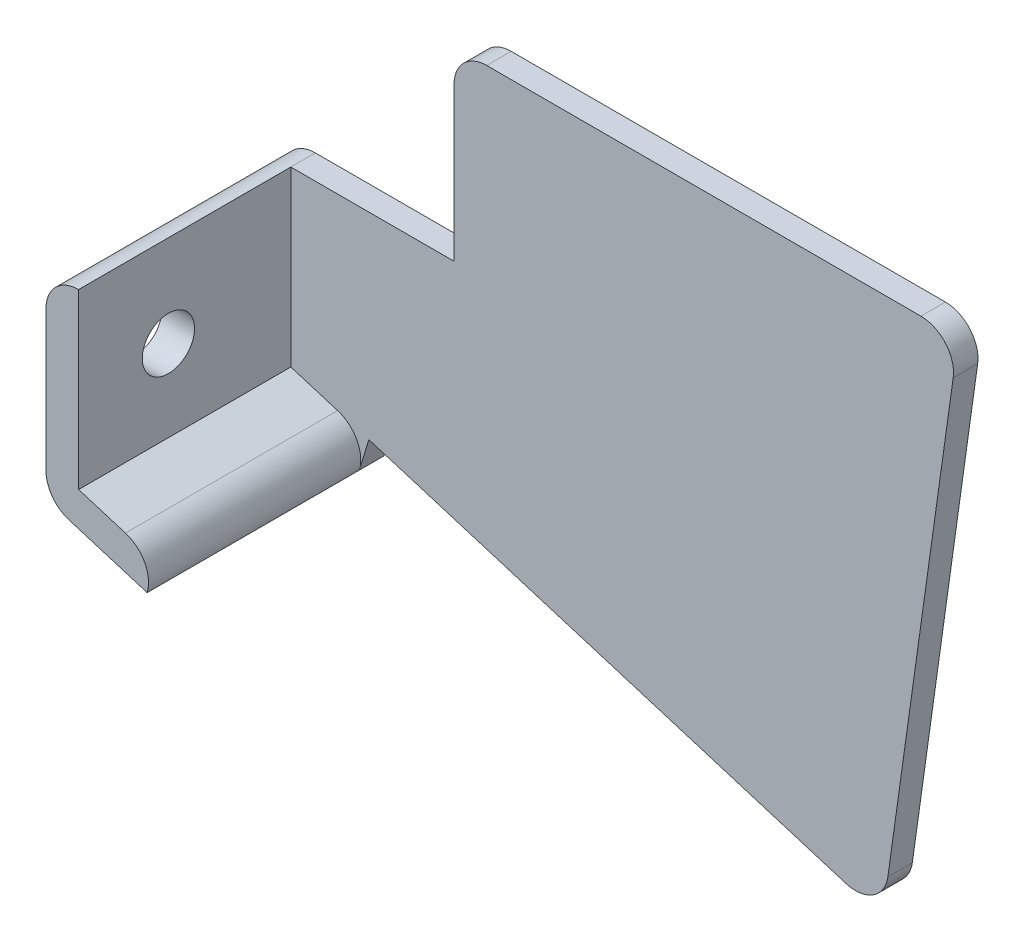
ISO-10303-21;
HEADER;
FILE_DESCRIPTION(('STEP AP214'),'2;1');
FILE_NAME('part.step','',(''),(''),'','','');
FILE_SCHEMA(('AUTOMOTIVE_DESIGN { 1 0 10303 214 1 1 1 1 }'));
ENDSEC;
DATA;
#1=APPLICATION_CONTEXT('core data for automotive mechanical design processes');
#2=APPLICATION_PROTOCOL_DEFINITION('international standard','automotive_design',2000,#1);
#3=PRODUCT_CONTEXT('',#1,'mechanical');
#4=PRODUCT('Part','Part','',(#3));
#5=PRODUCT_RELATED_PRODUCT_CATEGORY('part','',(#4));
#6=PRODUCT_DEFINITION_FORMATION('','',#4);
#7=PRODUCT_DEFINITION_CONTEXT('part definition',#1,'design');
#8=PRODUCT_DEFINITION('design','',#6,#7);
#9=PRODUCT_DEFINITION_SHAPE('','',#8);
#10=(LENGTH_UNIT() NAMED_UNIT(*) SI_UNIT(.MILLI.,.METRE.));
#11=(NAMED_UNIT(*) PLANE_ANGLE_UNIT() SI_UNIT($,.RADIAN.));
#12=(NAMED_UNIT(*) SI_UNIT($,.STERADIAN.) SOLID_ANGLE_UNIT());
#13=UNCERTAINTY_MEASURE_WITH_UNIT(LENGTH_MEASURE(1.E-05),#10,'distance_accuracy_value','');
#14=(GEOMETRIC_REPRESENTATION_CONTEXT(3) GLOBAL_UNCERTAINTY_ASSIGNED_CONTEXT((#13)) GLOBAL_UNIT_ASSIGNED_CONTEXT((#10,
#11,#12)) REPRESENTATION_CONTEXT('',''));
#15=CARTESIAN_POINT('',(0.,0.,0.));
#16=DIRECTION('',(0.,0.,1.));
#17=DIRECTION('',(1.,0.,0.));
#18=AXIS2_PLACEMENT_3D('',#15,#16,#17);
#19=CARTESIAN_POINT('',(20.0779656872939,-36.4951576865951,1.5));
#20=DIRECTION('',(-0.990268068741571,0.139173100960062,0.));
#21=DIRECTION('',(-0.139173100960062,-0.990268068741571,0.));
#22=AXIS2_PLACEMENT_3D('',#19,#20,#21);
#23=PLANE('',#22);
#24=DIRECTION('',(0.139173100960062,0.990268068741571,0.));
#25=VECTOR('',#24,1.);
#26=CARTESIAN_POINT('',(20.0779656872939,-36.4951576865951,1.5));
#27=LINE('',#26,#25);
#28=CARTESIAN_POINT('',(20.4038672170412,-34.1762478093528,1.5));
#29=VERTEX_POINT('',#28);
#30=CARTESIAN_POINT('',(24.4073443131452,-5.69002809547447,1.5));
#31=VERTEX_POINT('',#30);
#32=EDGE_CURVE('E267',#29,#31,#27,.T.);
#33=ORIENTED_EDGE('',*,*,#32,.F.);
#34=DIRECTION('',(0.,0.,-1.));
#35=VECTOR('',#34,1.);
#36=CARTESIAN_POINT('',(20.4038672170412,-34.1762478093528,1.5));
#37=LINE('',#36,#35);
#38=CARTESIAN_POINT('',(20.4038672170412,-34.1762478093528,0.));
#39=VERTEX_POINT('',#38);
#40=EDGE_CURVE('E229',#29,#39,#37,.T.);
#41=ORIENTED_EDGE('',*,*,#40,.T.);
#42=DIRECTION('',(0.139173100960062,0.990268068741571,0.));
#43=VECTOR('',#42,1.);
#44=CARTESIAN_POINT('',(20.0779656872939,-36.4951576865951,0.));
#45=LINE('',#44,#43);
#46=CARTESIAN_POINT('',(24.4073443131452,-5.69002809547447,0.));
#47=VERTEX_POINT('',#46);
#48=EDGE_CURVE('E289',#39,#47,#45,.T.);
#49=ORIENTED_EDGE('',*,*,#48,.T.);
#50=DIRECTION('',(0.,0.,-1.));
#51=VECTOR('',#50,1.);
#52=CARTESIAN_POINT('',(24.4073443131452,-5.69002809547447,1.5));
#53=LINE('',#52,#51);
#54=EDGE_CURVE('E226',#47,#31,#53,.F.);
#55=ORIENTED_EDGE('',*,*,#54,.T.);
#56=EDGE_LOOP('',(#33,#41,#49,#55));
#57=FACE_BOUND('',#56,.T.);
#58=ADVANCED_FACE('F45',(#57),#23,.F.);
#59=CARTESIAN_POINT('',(-6.17422455122754,-3.41168189355435,1.5));
#60=DIRECTION('',(0.,-1.,0.));
#61=DIRECTION('',(0.,0.,-1.));
#62=AXIS2_PLACEMENT_3D('',#59,#60,#61);
#63=PLANE('',#62);
#64=DIRECTION('',(-1.,0.,0.));
#65=VECTOR('',#64,1.);
#66=CARTESIAN_POINT('',(-6.17422455122754,-3.41168189355435,0.));
#67=LINE('',#66,#65);
#68=CARTESIAN_POINT('',(22.4268081756621,-3.41168189355435,0.));
#69=VERTEX_POINT('',#68);
#70=CARTESIAN_POINT('',(-4.17422455122754,-3.41168189355435,0.));
#71=VERTEX_POINT('',#70);
#72=EDGE_CURVE('E260',#69,#71,#67,.T.);
#73=ORIENTED_EDGE('',*,*,#72,.T.);
#74=DIRECTION('',(0.,0.,-1.));
#75=VECTOR('',#74,1.);
#76=CARTESIAN_POINT('',(-4.17422455122754,-3.41168189355435,1.5));
#77=LINE('',#76,#75);
#78=CARTESIAN_POINT('',(-4.17422455122754,-3.41168189355435,1.5));
#79=VERTEX_POINT('',#78);
#80=EDGE_CURVE('E54',#71,#79,#77,.F.);
#81=ORIENTED_EDGE('',*,*,#80,.T.);
#82=DIRECTION('',(-1.,0.,0.));
#83=VECTOR('',#82,1.);
#84=CARTESIAN_POINT('',(-6.17422455122754,-3.41168189355435,1.5));
#85=LINE('',#84,#83);
#86=CARTESIAN_POINT('',(22.4268081756621,-3.41168189355435,1.5));
#87=VERTEX_POINT('',#86);
#88=EDGE_CURVE('E257',#87,#79,#85,.T.);
#89=ORIENTED_EDGE('',*,*,#88,.F.);
#90=DIRECTION('',(0.,0.,-1.));
#91=VECTOR('',#90,1.);
#92=CARTESIAN_POINT('',(22.4268081756621,-3.41168189355435,1.5));
#93=LINE('',#92,#91);
#94=EDGE_CURVE('E248',#87,#69,#93,.T.);
#95=ORIENTED_EDGE('',*,*,#94,.T.);
#96=EDGE_LOOP('',(#73,#81,#89,#95));
#97=FACE_BOUND('',#96,.T.);
#98=ADVANCED_FACE('F256',(#97),#63,.F.);
#99=CARTESIAN_POINT('',(-6.17422455122754,-3.41168189355435,1.5));
#100=DIRECTION('',(1.,0.,0.));
#101=DIRECTION('',(0.,1.,0.));
#102=AXIS2_PLACEMENT_3D('',#99,#100,#101);
#103=PLANE('',#102);
#104=DIRECTION('',(0.,-1.,0.));
#105=VECTOR('',#104,1.);
#106=CARTESIAN_POINT('',(-6.17422455122754,-3.41168189355435,1.5));
#107=LINE('',#106,#105);
#108=CARTESIAN_POINT('',(-6.17422455122754,-5.41168189355435,1.5));
#109=VERTEX_POINT('',#108);
#110=CARTESIAN_POINT('',(-6.17422455122754,-14.8002894976858,1.5));
#111=VERTEX_POINT('',#110);
#112=EDGE_CURVE('E266',#109,#111,#107,.T.);
#113=ORIENTED_EDGE('',*,*,#112,.F.);
#114=DIRECTION('',(0.,0.,-1.));
#115=VECTOR('',#114,1.);
#116=CARTESIAN_POINT('',(-6.17422455122754,-5.41168189355435,1.5));
#117=LINE('',#116,#115);
#118=CARTESIAN_POINT('',(-6.17422455122754,-5.41168189355435,0.));
#119=VERTEX_POINT('',#118);
#120=EDGE_CURVE('E244',#109,#119,#117,.T.);
#121=ORIENTED_EDGE('',*,*,#120,.T.);
#122=DIRECTION('',(0.,-1.,0.));
#123=VECTOR('',#122,1.);
#124=CARTESIAN_POINT('',(-6.17422455122754,-3.41168189355435,0.));
#125=LINE('',#124,#123);
#126=CARTESIAN_POINT('',(-6.17422455122754,-14.8002894976858,0.));
#127=VERTEX_POINT('',#126);
#128=EDGE_CURVE('E275',#119,#127,#125,.T.);
#129=ORIENTED_EDGE('',*,*,#128,.T.);
#130=DIRECTION('',(0.,0.,-1.));
#131=VECTOR('',#130,1.);
#132=CARTESIAN_POINT('',(-6.17422455122754,-14.8002894976858,1.5));
#133=LINE('',#132,#131);
#134=EDGE_CURVE('E300',#111,#127,#133,.T.);
#135=ORIENTED_EDGE('',*,*,#134,.F.);
#136=EDGE_LOOP('',(#113,#121,#129,#135));
#137=FACE_BOUND('',#136,.T.);
#138=ADVANCED_FACE('F273',(#137),#103,.F.);
#139=CARTESIAN_POINT('',(-18.1742245512275,-14.8002894976858,1.5));
#140=DIRECTION('',(0.,-1.,0.));
#141=DIRECTION('',(0.,0.,-1.));
#142=AXIS2_PLACEMENT_3D('',#139,#140,#141);
#143=PLANE('',#142);
#144=DIRECTION('',(-1.,0.,0.));
#145=VECTOR('',#144,1.);
#146=CARTESIAN_POINT('',(-18.1742245512275,-14.8002894976858,0.));
#147=LINE('',#146,#145);
#148=CARTESIAN_POINT('',(-16.1742245512275,-14.8002894976858,0.));
#149=VERTEX_POINT('',#148);
#150=EDGE_CURVE('E282',#127,#149,#147,.T.);
#151=ORIENTED_EDGE('',*,*,#150,.T.);
#152=DIRECTION('',(0.,0.,-1.));
#153=VECTOR('',#152,1.);
#154=CARTESIAN_POINT('',(-16.1742245512275,-14.8002894976858,1.5));
#155=LINE('',#154,#153);
#156=CARTESIAN_POINT('',(-16.1742245512275,-14.8002894976858,1.5));
#157=VERTEX_POINT('',#156);
#158=EDGE_CURVE('E219',#149,#157,#155,.F.);
#159=ORIENTED_EDGE('',*,*,#158,.T.);
#160=DIRECTION('',(-1.,0.,0.));
#161=VECTOR('',#160,1.);
#162=CARTESIAN_POINT('',(-18.1742245512275,-14.8002894976858,1.5));
#163=LINE('',#162,#161);
#164=EDGE_CURVE('E349',#111,#157,#163,.T.);
#165=ORIENTED_EDGE('',*,*,#164,.F.);
#166=ORIENTED_EDGE('',*,*,#134,.T.);
#167=EDGE_LOOP('',(#151,#159,#165,#166));
#168=FACE_BOUND('',#167,.T.);
#169=ADVANCED_FACE('F436',(#168),#143,.F.);
#170=CARTESIAN_POINT('',(-18.1742245512275,-14.8002894976858,1.5));
#171=DIRECTION('',(1.,0.,0.));
#172=DIRECTION('',(0.,1.,0.));
#173=AXIS2_PLACEMENT_3D('',#170,#171,#172);
#174=PLANE('',#173);
#175=CARTESIAN_POINT('',(-18.1742245512275,-20.4117508606031,9.));
#176=DIRECTION('',(1.,0.,0.));
#177=DIRECTION('',(0.,1.,0.));
#178=AXIS2_PLACEMENT_3D('',#175,#176,#177);
#179=CIRCLE('',#178,1.6);
#180=CARTESIAN_POINT('',(-18.1742245512275,-18.8117508606031,9.));
#181=VERTEX_POINT('',#180);
#182=EDGE_CURVE('E397',#181,#181,#179,.F.);
#183=ORIENTED_EDGE('',*,*,#182,.F.);
#184=EDGE_LOOP('',(#183));
#185=FACE_BOUND('',#184,.T.);
#186=DIRECTION('',(0.,1.,0.));
#187=VECTOR('',#186,1.);
#188=CARTESIAN_POINT('',(-18.1742245512275,-14.8002894976858,14.5));
#189=LINE('',#188,#187);
#190=CARTESIAN_POINT('',(-18.1742245512275,-25.4117508606031,14.5));
#191=VERTEX_POINT('',#190);
#192=CARTESIAN_POINT('',(-18.1742245512275,-16.8002894976858,14.5));
#193=VERTEX_POINT('',#192);
#194=EDGE_CURVE('E183',#191,#193,#189,.T.);
#195=ORIENTED_EDGE('',*,*,#194,.T.);
#196=DIRECTION('',(0.,0.,-1.));
#197=VECTOR('',#196,1.);
#198=CARTESIAN_POINT('',(-18.1742245512275,-16.8002894976858,1.5));
#199=LINE('',#198,#197);
#200=CARTESIAN_POINT('',(-18.1742245512275,-16.8002894976858,0.));
#201=VERTEX_POINT('',#200);
#202=EDGE_CURVE('E188',#193,#201,#199,.T.);
#203=ORIENTED_EDGE('',*,*,#202,.T.);
#204=DIRECTION('',(0.,-1.,0.));
#205=VECTOR('',#204,1.);
#206=CARTESIAN_POINT('',(-18.1742245512275,-14.8002894976858,0.));
#207=LINE('',#206,#205);
#208=CARTESIAN_POINT('',(-18.1742245512275,-25.4117508606031,0.));
#209=VERTEX_POINT('',#208);
#210=EDGE_CURVE('E287',#201,#209,#207,.T.);
#211=ORIENTED_EDGE('',*,*,#210,.T.);
#212=DIRECTION('',(0.,0.,-1.));
#213=VECTOR('',#212,1.);
#214=CARTESIAN_POINT('',(-18.1742245512275,-25.4117508606031,14.5));
#215=LINE('',#214,#213);
#216=EDGE_CURVE('E195',#209,#191,#215,.F.);
#217=ORIENTED_EDGE('',*,*,#216,.T.);
#218=EDGE_LOOP('',(#195,#203,#211,#217));
#219=FACE_BOUND('',#218,.T.);
#220=ADVANCED_FACE('F433',(#185,#219),#174,.F.);
#221=CARTESIAN_POINT('',(-18.1742245512275,-24.8002894976858,1.5));
#222=DIRECTION('',(0.292371704722734,0.956304755963036,0.));
#223=DIRECTION('',(-0.956304755963036,0.292371704722734,0.));
#224=AXIS2_PLACEMENT_3D('',#221,#222,#223);
#225=PLANE('',#224);
#226=DIRECTION('',(0.956304755963036,-0.292371704722734,0.));
#227=VECTOR('',#226,1.);
#228=CARTESIAN_POINT('',(-18.1742245512275,-24.8002894976858,0.));
#229=LINE('',#228,#227);
#230=CARTESIAN_POINT('',(-11.3927007714124,-26.8736093842168,0.));
#231=VERTEX_POINT('',#230);
#232=CARTESIAN_POINT('',(17.8385876701126,-35.8105111193588,0.));
#233=VERTEX_POINT('',#232);
#234=EDGE_CURVE('E296',#231,#233,#229,.T.);
#235=ORIENTED_EDGE('',*,*,#234,.T.);
#236=DIRECTION('',(0.,0.,-1.));
#237=VECTOR('',#236,1.);
#238=CARTESIAN_POINT('',(17.8385876701125,-35.8105111193588,1.5));
#239=LINE('',#238,#237);
#240=CARTESIAN_POINT('',(17.8385876701126,-35.8105111193588,1.5));
#241=VERTEX_POINT('',#240);
#242=EDGE_CURVE('E233',#233,#241,#239,.F.);
#243=ORIENTED_EDGE('',*,*,#242,.T.);
#244=DIRECTION('',(0.956304755963036,-0.292371704722734,0.));
#245=VECTOR('',#244,1.);
#246=CARTESIAN_POINT('',(-18.1742245512275,-24.8002894976858,1.5));
#247=LINE('',#246,#245);
#248=CARTESIAN_POINT('',(-11.3927007714124,-26.8736093842168,1.5));
#249=VERTEX_POINT('',#248);
#250=EDGE_CURVE('E304',#249,#241,#247,.T.);
#251=ORIENTED_EDGE('',*,*,#250,.F.);
#252=DIRECTION('',(0.,0.,-1.));
#253=VECTOR('',#252,1.);
#254=CARTESIAN_POINT('',(-11.3927007714124,-26.8736093842168,14.5));
#255=LINE('',#254,#253);
#256=EDGE_CURVE('E315',#249,#231,#255,.T.);
#257=ORIENTED_EDGE('',*,*,#256,.T.);
#258=EDGE_LOOP('',(#235,#243,#251,#257));
#259=FACE_BOUND('',#258,.T.);
#260=ADVANCED_FACE('F394',(#259),#225,.F.);
#261=CARTESIAN_POINT('',(0.,0.,1.5));
#262=DIRECTION('',(0.,0.,-1.));
#263=DIRECTION('',(-1.,0.,0.));
#264=AXIS2_PLACEMENT_3D('',#261,#262,#263);
#265=PLANE('',#264);
#266=ORIENTED_EDGE('',*,*,#250,.T.);
#267=CARTESIAN_POINT('',(18.423331079558,-33.8979016074327,1.5));
#268=DIRECTION('',(0.,0.,-1.));
#269=DIRECTION('',(-1.,0.,0.));
#270=AXIS2_PLACEMENT_3D('',#267,#268,#269);
#271=CIRCLE('',#270,2.);
#272=EDGE_CURVE('E241',#241,#29,#271,.F.);
#273=ORIENTED_EDGE('',*,*,#272,.T.);
#274=ORIENTED_EDGE('',*,*,#32,.T.);
#275=CARTESIAN_POINT('',(22.4268081756621,-5.41168189355435,1.5));
#276=DIRECTION('',(0.,0.,-1.));
#277=DIRECTION('',(-1.,0.,0.));
#278=AXIS2_PLACEMENT_3D('',#275,#276,#277);
#279=CIRCLE('',#278,2.);
#280=EDGE_CURVE('E236',#31,#87,#279,.F.);
#281=ORIENTED_EDGE('',*,*,#280,.T.);
#282=ORIENTED_EDGE('',*,*,#88,.T.);
#283=CARTESIAN_POINT('',(-4.17422455122754,-5.41168189355435,1.5));
#284=DIRECTION('',(0.,0.,-1.));
#285=DIRECTION('',(-1.,0.,0.));
#286=AXIS2_PLACEMENT_3D('',#283,#284,#285);
#287=CIRCLE('',#286,2.);
#288=EDGE_CURVE('E67',#79,#109,#287,.F.);
#289=ORIENTED_EDGE('',*,*,#288,.T.);
#290=ORIENTED_EDGE('',*,*,#112,.T.);
#291=ORIENTED_EDGE('',*,*,#164,.T.);
#292=DIRECTION('',(0.,-1.,0.));
#293=VECTOR('',#292,1.);
#294=CARTESIAN_POINT('',(-16.1742245512275,0.,1.5));
#295=LINE('',#294,#293);
#296=CARTESIAN_POINT('',(-16.1742245512275,-25.4117508606031,1.5));
#297=VERTEX_POINT('',#296);
#298=EDGE_CURVE('E165',#157,#297,#295,.T.);
#299=ORIENTED_EDGE('',*,*,#298,.T.);
#300=DIRECTION('',(0.956304755963036,-0.292371704722735,0.));
#301=VECTOR('',#300,1.);
#302=CARTESIAN_POINT('',(-8.48762771866673,-27.7617793483199,1.5));
#303=LINE('',#302,#301);
#304=CARTESIAN_POINT('',(-13.3053102833384,-26.2888659747713,1.5));
#305=VERTEX_POINT('',#304);
#306=EDGE_CURVE('E333',#297,#305,#303,.T.);
#307=ORIENTED_EDGE('',*,*,#306,.T.);
#308=CARTESIAN_POINT('',(-13.8900536927839,-28.2014754866974,1.5));
#309=DIRECTION('',(0.,0.,-1.));
#310=DIRECTION('',(-1.,0.,0.));
#311=AXIS2_PLACEMENT_3D('',#308,#309,#310);
#312=CIRCLE('',#311,2.);
#313=CARTESIAN_POINT('',(-11.9774441808578,-28.7862188961428,1.5));
#314=VERTEX_POINT('',#313);
#315=EDGE_CURVE('E11',#305,#314,#312,.T.);
#316=ORIENTED_EDGE('',*,*,#315,.T.);
#317=DIRECTION('',(-0.292371704722734,-0.956304755963036,0.));
#318=VECTOR('',#317,1.);
#319=CARTESIAN_POINT('',(-2.90507305274566,0.88816996410311,1.5));
#320=LINE('',#319,#318);
#321=EDGE_CURVE('E60',#249,#314,#320,.T.);
#322=ORIENTED_EDGE('',*,*,#321,.F.);
#323=EDGE_LOOP('',(#266,#273,#274,#281,#282,#289,#290,#291,#299,#307,#316,#322));
#324=FACE_BOUND('',#323,.T.);
#325=ADVANCED_FACE('F262',(#324),#265,.F.);
#326=CARTESIAN_POINT('',(0.,0.,0.));
#327=DIRECTION('',(0.,0.,-1.));
#328=DIRECTION('',(-1.,0.,0.));
#329=AXIS2_PLACEMENT_3D('',#326,#327,#328);
#330=PLANE('',#329);
#331=ORIENTED_EDGE('',*,*,#210,.F.);
#332=CARTESIAN_POINT('',(-16.1742245512275,-16.8002894976858,0.));
#333=DIRECTION('',(0.,0.,-1.));
#334=DIRECTION('',(-1.,0.,0.));
#335=AXIS2_PLACEMENT_3D('',#332,#333,#334);
#336=CIRCLE('',#335,2.);
#337=EDGE_CURVE('E216',#201,#149,#336,.T.);
#338=ORIENTED_EDGE('',*,*,#337,.T.);
#339=ORIENTED_EDGE('',*,*,#150,.F.);
#340=ORIENTED_EDGE('',*,*,#128,.F.);
#341=CARTESIAN_POINT('',(-4.17422455122754,-5.41168189355435,0.));
#342=DIRECTION('',(0.,0.,-1.));
#343=DIRECTION('',(-1.,0.,0.));
#344=AXIS2_PLACEMENT_3D('',#341,#342,#343);
#345=CIRCLE('',#344,2.);
#346=EDGE_CURVE('E207',#119,#71,#345,.T.);
#347=ORIENTED_EDGE('',*,*,#346,.T.);
#348=ORIENTED_EDGE('',*,*,#72,.F.);
#349=CARTESIAN_POINT('',(22.4268081756621,-5.41168189355435,0.));
#350=DIRECTION('',(0.,0.,-1.));
#351=DIRECTION('',(-1.,0.,0.));
#352=AXIS2_PLACEMENT_3D('',#349,#350,#351);
#353=CIRCLE('',#352,2.);
#354=EDGE_CURVE('E204',#69,#47,#353,.T.);
#355=ORIENTED_EDGE('',*,*,#354,.T.);
#356=ORIENTED_EDGE('',*,*,#48,.F.);
#357=CARTESIAN_POINT('',(18.423331079558,-33.8979016074327,0.));
#358=DIRECTION('',(0.,0.,-1.));
#359=DIRECTION('',(-1.,0.,0.));
#360=AXIS2_PLACEMENT_3D('',#357,#358,#359);
#361=CIRCLE('',#360,2.);
#362=EDGE_CURVE('E210',#39,#233,#361,.T.);
#363=ORIENTED_EDGE('',*,*,#362,.T.);
#364=ORIENTED_EDGE('',*,*,#234,.F.);
#365=DIRECTION('',(-0.292371704722734,-0.956304755963036,0.));
#366=VECTOR('',#365,1.);
#367=CARTESIAN_POINT('',(-11.3927007714124,-26.8736093842168,0.));
#368=LINE('',#367,#366);
#369=CARTESIAN_POINT('',(-11.9774441808578,-28.7862188961428,0.));
#370=VERTEX_POINT('',#369);
#371=EDGE_CURVE('E395',#231,#370,#368,.T.);
#372=ORIENTED_EDGE('',*,*,#371,.T.);
#373=DIRECTION('',(-0.956304755963036,0.292371704722734,0.));
#374=VECTOR('',#373,1.);
#375=CARTESIAN_POINT('',(-11.9774441808578,-28.7862188961428,0.));
#376=LINE('',#375,#374);
#377=CARTESIAN_POINT('',(-16.758967960673,-27.3243603725292,0.));
#378=VERTEX_POINT('',#377);
#379=EDGE_CURVE('E324',#370,#378,#376,.T.);
#380=ORIENTED_EDGE('',*,*,#379,.T.);
#381=CARTESIAN_POINT('',(-16.1742245512275,-25.4117508606031,0.));
#382=DIRECTION('',(0.,0.,-1.));
#383=DIRECTION('',(-1.,0.,0.));
#384=AXIS2_PLACEMENT_3D('',#381,#382,#383);
#385=CIRCLE('',#384,2.);
#386=EDGE_CURVE('E213',#378,#209,#385,.T.);
#387=ORIENTED_EDGE('',*,*,#386,.T.);
#388=EDGE_LOOP('',(#331,#338,#339,#340,#347,#348,#355,#356,#363,#364,#372,#380,#387));
#389=FACE_BOUND('',#388,.T.);
#390=ADVANCED_FACE('F280',(#389),#330,.T.);
#391=CARTESIAN_POINT('',(-16.1742245512275,-25.4117508606031,14.5));
#392=DIRECTION('',(0.292371704722735,0.956304755963036,0.));
#393=DIRECTION('',(-0.956304755963036,0.292371704722735,0.));
#394=AXIS2_PLACEMENT_3D('',#391,#392,#393);
#395=PLANE('',#394);
#396=DIRECTION('',(0.956304755963036,-0.292371704722735,0.));
#397=VECTOR('',#396,1.);
#398=CARTESIAN_POINT('',(-16.1742245512275,-25.4117508606031,14.5));
#399=LINE('',#398,#397);
#400=CARTESIAN_POINT('',(-16.1742245512275,-25.4117508606031,14.5));
#401=VERTEX_POINT('',#400);
#402=CARTESIAN_POINT('',(-13.3053102833384,-26.2888659747713,14.5));
#403=VERTEX_POINT('',#402);
#404=EDGE_CURVE('E181',#401,#403,#399,.T.);
#405=ORIENTED_EDGE('',*,*,#404,.T.);
#406=DIRECTION('',(0.,0.,-1.));
#407=VECTOR('',#406,1.);
#408=CARTESIAN_POINT('',(-13.3053102833384,-26.2888659747713,14.5));
#409=LINE('',#408,#407);
#410=EDGE_CURVE('E303',#403,#305,#409,.T.);
#411=ORIENTED_EDGE('',*,*,#410,.T.);
#412=ORIENTED_EDGE('',*,*,#306,.F.);
#413=DIRECTION('',(0.,0.,-1.));
#414=VECTOR('',#413,1.);
#415=CARTESIAN_POINT('',(-16.1742245512275,-25.4117508606031,14.5));
#416=LINE('',#415,#414);
#417=EDGE_CURVE('E170',#401,#297,#416,.T.);
#418=ORIENTED_EDGE('',*,*,#417,.F.);
#419=EDGE_LOOP('',(#405,#411,#412,#418));
#420=FACE_BOUND('',#419,.T.);
#421=ADVANCED_FACE('F416',(#420),#395,.T.);
#422=CARTESIAN_POINT('',(-16.1742245512275,-14.8002894976858,14.5));
#423=DIRECTION('',(1.,0.,0.));
#424=DIRECTION('',(0.,0.,-1.));
#425=AXIS2_PLACEMENT_3D('',#422,#423,#424);
#426=PLANE('',#425);
#427=CARTESIAN_POINT('',(-16.1742245512275,-20.4117508606031,9.));
#428=DIRECTION('',(1.,0.,0.));
#429=DIRECTION('',(0.,0.,-1.));
#430=AXIS2_PLACEMENT_3D('',#427,#428,#429);
#431=CIRCLE('',#430,1.6);
#432=CARTESIAN_POINT('',(-16.1742245512275,-20.4117508606031,7.4));
#433=VERTEX_POINT('',#432);
#434=EDGE_CURVE('E401',#433,#433,#431,.T.);
#435=ORIENTED_EDGE('',*,*,#434,.F.);
#436=EDGE_LOOP('',(#435));
#437=FACE_BOUND('',#436,.T.);
#438=ORIENTED_EDGE('',*,*,#298,.F.);
#439=DIRECTION('',(0.,0.,-1.));
#440=VECTOR('',#439,1.);
#441=CARTESIAN_POINT('',(-16.1742245512275,-14.8002894976858,14.5));
#442=LINE('',#441,#440);
#443=CARTESIAN_POINT('',(-16.1742245512275,-14.8002894976858,14.5));
#444=VERTEX_POINT('',#443);
#445=EDGE_CURVE('E160',#444,#157,#442,.T.);
#446=ORIENTED_EDGE('',*,*,#445,.F.);
#447=DIRECTION('',(0.,-1.,0.));
#448=VECTOR('',#447,1.);
#449=CARTESIAN_POINT('',(-16.1742245512275,-14.8002894976858,14.5));
#450=LINE('',#449,#448);
#451=EDGE_CURVE('E164',#444,#401,#450,.T.);
#452=ORIENTED_EDGE('',*,*,#451,.T.);
#453=ORIENTED_EDGE('',*,*,#417,.T.);
#454=EDGE_LOOP('',(#438,#446,#452,#453));
#455=FACE_BOUND('',#454,.T.);
#456=ADVANCED_FACE('F162',(#437,#455),#426,.T.);
#457=CARTESIAN_POINT('',(-11.9774441808578,-28.7862188961428,14.5));
#458=DIRECTION('',(-0.292371704722734,-0.956304755963036,0.));
#459=DIRECTION('',(0.956304755963036,-0.292371704722734,0.));
#460=AXIS2_PLACEMENT_3D('',#457,#458,#459);
#461=PLANE('',#460);
#462=DIRECTION('',(-0.956304755963036,0.292371704722734,0.));
#463=VECTOR('',#462,1.);
#464=CARTESIAN_POINT('',(-11.9774441808578,-28.7862188961428,14.5));
#465=LINE('',#464,#463);
#466=CARTESIAN_POINT('',(-11.9774441808578,-28.7862188961428,14.5));
#467=VERTEX_POINT('',#466);
#468=CARTESIAN_POINT('',(-16.758967960673,-27.3243603725292,14.5));
#469=VERTEX_POINT('',#468);
#470=EDGE_CURVE('E171',#467,#469,#465,.T.);
#471=ORIENTED_EDGE('',*,*,#470,.T.);
#472=DIRECTION('',(0.,0.,-1.));
#473=VECTOR('',#472,1.);
#474=CARTESIAN_POINT('',(-16.758967960673,-27.3243603725292,0.));
#475=LINE('',#474,#473);
#476=EDGE_CURVE('E222',#469,#378,#475,.T.);
#477=ORIENTED_EDGE('',*,*,#476,.T.);
#478=ORIENTED_EDGE('',*,*,#379,.F.);
#479=DIRECTION('',(0.,0.,-1.));
#480=VECTOR('',#479,1.);
#481=CARTESIAN_POINT('',(-11.9774441808578,-28.7862188961428,14.5));
#482=LINE('',#481,#480);
#483=EDGE_CURVE('E312',#314,#370,#482,.T.);
#484=ORIENTED_EDGE('',*,*,#483,.F.);
#485=EDGE_CURVE('E322',#467,#314,#482,.T.);
#486=ORIENTED_EDGE('',*,*,#485,.F.);
#487=EDGE_LOOP('',(#471,#477,#478,#484,#486));
#488=FACE_BOUND('',#487,.T.);
#489=ADVANCED_FACE('F321',(#488),#461,.T.);
#490=CARTESIAN_POINT('',(-11.3927007714124,-26.8736093842168,14.5));
#491=DIRECTION('',(0.956304755963036,-0.292371704722734,0.));
#492=DIRECTION('',(0.292371704722734,0.956304755963036,0.));
#493=AXIS2_PLACEMENT_3D('',#490,#491,#492);
#494=PLANE('',#493);
#495=ORIENTED_EDGE('',*,*,#256,.F.);
#496=ORIENTED_EDGE('',*,*,#321,.T.);
#497=ORIENTED_EDGE('',*,*,#483,.T.);
#498=ORIENTED_EDGE('',*,*,#371,.F.);
#499=EDGE_LOOP('',(#495,#496,#497,#498));
#500=FACE_BOUND('',#499,.T.);
#501=ADVANCED_FACE('F310',(#500),#494,.T.);
#502=CARTESIAN_POINT('',(0.,0.,14.5));
#503=DIRECTION('',(0.,0.,1.));
#504=DIRECTION('',(1.,0.,0.));
#505=AXIS2_PLACEMENT_3D('',#502,#503,#504);
#506=PLANE('',#505);
#507=ORIENTED_EDGE('',*,*,#470,.F.);
#508=CARTESIAN_POINT('',(-13.8900536927839,-28.2014754866974,14.5));
#509=DIRECTION('',(0.,0.,1.));
#510=DIRECTION('',(1.,0.,0.));
#511=AXIS2_PLACEMENT_3D('',#508,#509,#510);
#512=CIRCLE('',#511,2.);
#513=EDGE_CURVE('E190',#467,#403,#512,.T.);
#514=ORIENTED_EDGE('',*,*,#513,.T.);
#515=ORIENTED_EDGE('',*,*,#404,.F.);
#516=ORIENTED_EDGE('',*,*,#451,.F.);
#517=CARTESIAN_POINT('',(-16.1742245512275,-16.8002894976858,14.5));
#518=DIRECTION('',(0.,0.,1.));
#519=DIRECTION('',(1.,0.,0.));
#520=AXIS2_PLACEMENT_3D('',#517,#518,#519);
#521=CIRCLE('',#520,2.);
#522=EDGE_CURVE('E178',#444,#193,#521,.T.);
#523=ORIENTED_EDGE('',*,*,#522,.T.);
#524=ORIENTED_EDGE('',*,*,#194,.F.);
#525=CARTESIAN_POINT('',(-16.1742245512275,-25.4117508606031,14.5));
#526=DIRECTION('',(0.,0.,1.));
#527=DIRECTION('',(1.,0.,0.));
#528=AXIS2_PLACEMENT_3D('',#525,#526,#527);
#529=CIRCLE('',#528,2.);
#530=EDGE_CURVE('E191',#191,#469,#529,.T.);
#531=ORIENTED_EDGE('',*,*,#530,.T.);
#532=EDGE_LOOP('',(#507,#514,#515,#516,#523,#524,#531));
#533=FACE_BOUND('',#532,.T.);
#534=ADVANCED_FACE('F176',(#533),#506,.T.);
#535=CARTESIAN_POINT('',(-13.8900536927839,-28.2014754866974,14.5));
#536=DIRECTION('',(0.,0.,-1.));
#537=DIRECTION('',(-1.,0.,0.));
#538=AXIS2_PLACEMENT_3D('',#535,#536,#537);
#539=CYLINDRICAL_SURFACE('',#538,2.);
#540=ORIENTED_EDGE('',*,*,#513,.F.);
#541=ORIENTED_EDGE('',*,*,#485,.T.);
#542=ORIENTED_EDGE('',*,*,#315,.F.);
#543=ORIENTED_EDGE('',*,*,#410,.F.);
#544=EDGE_LOOP('',(#540,#541,#542,#543));
#545=FACE_BOUND('',#544,.T.);
#546=ADVANCED_FACE('F329',(#545),#539,.T.);
#547=CARTESIAN_POINT('',(-16.1742245512275,-16.8002894976858,1.5));
#548=DIRECTION('',(0.,0.,-1.));
#549=DIRECTION('',(-1.,0.,0.));
#550=AXIS2_PLACEMENT_3D('',#547,#548,#549);
#551=CYLINDRICAL_SURFACE('',#550,2.);
#552=ORIENTED_EDGE('',*,*,#445,.T.);
#553=ORIENTED_EDGE('',*,*,#158,.F.);
#554=ORIENTED_EDGE('',*,*,#337,.F.);
#555=ORIENTED_EDGE('',*,*,#202,.F.);
#556=ORIENTED_EDGE('',*,*,#522,.F.);
#557=EDGE_LOOP('',(#552,#553,#554,#555,#556));
#558=FACE_BOUND('',#557,.T.);
#559=ADVANCED_FACE('F186',(#558),#551,.T.);
#560=CARTESIAN_POINT('',(-16.1742245512275,-25.4117508606031,14.5));
#561=DIRECTION('',(0.,0.,1.));
#562=DIRECTION('',(1.,0.,0.));
#563=AXIS2_PLACEMENT_3D('',#560,#561,#562);
#564=CYLINDRICAL_SURFACE('',#563,2.);
#565=ORIENTED_EDGE('',*,*,#530,.F.);
#566=ORIENTED_EDGE('',*,*,#216,.F.);
#567=ORIENTED_EDGE('',*,*,#386,.F.);
#568=ORIENTED_EDGE('',*,*,#476,.F.);
#569=EDGE_LOOP('',(#565,#566,#567,#568));
#570=FACE_BOUND('',#569,.T.);
#571=ADVANCED_FACE('F383',(#570),#564,.T.);
#572=CARTESIAN_POINT('',(18.423331079558,-33.8979016074327,1.5));
#573=DIRECTION('',(0.,0.,-1.));
#574=DIRECTION('',(-1.,0.,0.));
#575=AXIS2_PLACEMENT_3D('',#572,#573,#574);
#576=CYLINDRICAL_SURFACE('',#575,2.);
#577=ORIENTED_EDGE('',*,*,#272,.F.);
#578=ORIENTED_EDGE('',*,*,#242,.F.);
#579=ORIENTED_EDGE('',*,*,#362,.F.);
#580=ORIENTED_EDGE('',*,*,#40,.F.);
#581=EDGE_LOOP('',(#577,#578,#579,#580));
#582=FACE_BOUND('',#581,.T.);
#583=ADVANCED_FACE('F370',(#582),#576,.T.);
#584=CARTESIAN_POINT('',(-4.17422455122754,-5.41168189355435,1.5));
#585=DIRECTION('',(0.,0.,-1.));
#586=DIRECTION('',(-1.,0.,0.));
#587=AXIS2_PLACEMENT_3D('',#584,#585,#586);
#588=CYLINDRICAL_SURFACE('',#587,2.);
#589=ORIENTED_EDGE('',*,*,#288,.F.);
#590=ORIENTED_EDGE('',*,*,#80,.F.);
#591=ORIENTED_EDGE('',*,*,#346,.F.);
#592=ORIENTED_EDGE('',*,*,#120,.F.);
#593=EDGE_LOOP('',(#589,#590,#591,#592));
#594=FACE_BOUND('',#593,.T.);
#595=ADVANCED_FACE('F270',(#594),#588,.T.);
#596=CARTESIAN_POINT('',(22.4268081756621,-5.41168189355435,1.5));
#597=DIRECTION('',(0.,0.,-1.));
#598=DIRECTION('',(-1.,0.,0.));
#599=AXIS2_PLACEMENT_3D('',#596,#597,#598);
#600=CYLINDRICAL_SURFACE('',#599,2.);
#601=ORIENTED_EDGE('',*,*,#280,.F.);
#602=ORIENTED_EDGE('',*,*,#54,.F.);
#603=ORIENTED_EDGE('',*,*,#354,.F.);
#604=ORIENTED_EDGE('',*,*,#94,.F.);
#605=EDGE_LOOP('',(#601,#602,#603,#604));
#606=FACE_BOUND('',#605,.T.);
#607=ADVANCED_FACE('F47',(#606),#600,.T.);
#608=CARTESIAN_POINT('',(-18.1752245512275,-20.4117508606031,9.));
#609=DIRECTION('',(1.,0.,0.));
#610=DIRECTION('',(0.,0.,-1.));
#611=AXIS2_PLACEMENT_3D('',#608,#609,#610);
#612=CYLINDRICAL_SURFACE('',#611,1.6);
#613=ORIENTED_EDGE('',*,*,#434,.T.);
#614=EDGE_LOOP('',(#613));
#615=FACE_BOUND('',#614,.T.);
#616=ORIENTED_EDGE('',*,*,#182,.T.);
#617=EDGE_LOOP('',(#616));
#618=FACE_BOUND('',#617,.T.);
#619=ADVANCED_FACE('F363',(#615,#618),#612,.F.);
#620=CLOSED_SHELL('',(#58,#98,#138,#169,#220,#260,#325,#390,#421,#456,#489,#501,#534,#546,#559,
#571,#583,#595,#607,#619));
#621=MANIFOLD_SOLID_BREP('B2',#620);
#622=ADVANCED_BREP_SHAPE_REPRESENTATION('',(#18,#621),#14);
#623=SHAPE_DEFINITION_REPRESENTATION(#9,#622);
ENDSEC;
END-ISO-10303-21;
